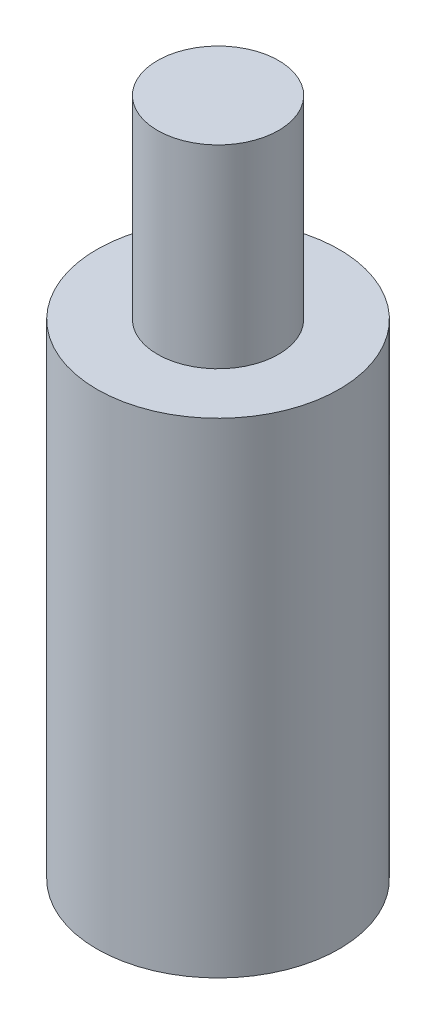
ISO-10303-21;
HEADER;
FILE_DESCRIPTION(('STEP AP214'),'2;1');
FILE_NAME('part.step','',(''),(''),'','','');
FILE_SCHEMA(('AUTOMOTIVE_DESIGN { 1 0 10303 214 1 1 1 1 }'));
ENDSEC;
DATA;
#1=APPLICATION_CONTEXT('core data for automotive mechanical design processes');
#2=APPLICATION_PROTOCOL_DEFINITION('international standard','automotive_design',2000,#1);
#3=PRODUCT_CONTEXT('',#1,'mechanical');
#4=PRODUCT('Part','Part','',(#3));
#5=PRODUCT_RELATED_PRODUCT_CATEGORY('part','',(#4));
#6=PRODUCT_DEFINITION_FORMATION('','',#4);
#7=PRODUCT_DEFINITION_CONTEXT('part definition',#1,'design');
#8=PRODUCT_DEFINITION('design','',#6,#7);
#9=PRODUCT_DEFINITION_SHAPE('','',#8);
#10=(LENGTH_UNIT() NAMED_UNIT(*) SI_UNIT(.MILLI.,.METRE.));
#11=(NAMED_UNIT(*) PLANE_ANGLE_UNIT() SI_UNIT($,.RADIAN.));
#12=(NAMED_UNIT(*) SI_UNIT($,.STERADIAN.) SOLID_ANGLE_UNIT());
#13=UNCERTAINTY_MEASURE_WITH_UNIT(LENGTH_MEASURE(1.E-05),#10,'distance_accuracy_value','');
#14=(GEOMETRIC_REPRESENTATION_CONTEXT(3) GLOBAL_UNCERTAINTY_ASSIGNED_CONTEXT((#13)) GLOBAL_UNIT_ASSIGNED_CONTEXT((#10,
#11,#12)) REPRESENTATION_CONTEXT('',''));
#15=CARTESIAN_POINT('',(0.,0.,0.));
#16=DIRECTION('',(0.,0.,1.));
#17=DIRECTION('',(1.,0.,0.));
#18=AXIS2_PLACEMENT_3D('',#15,#16,#17);
#19=CARTESIAN_POINT('',(0.,12.7,0.));
#20=DIRECTION('',(0.,-1.,0.));
#21=DIRECTION('',(0.,0.,-1.));
#22=AXIS2_PLACEMENT_3D('',#19,#20,#21);
#23=CYLINDRICAL_SURFACE('',#22,3.175);
#24=CARTESIAN_POINT('',(0.,12.7,0.));
#25=DIRECTION('',(0.,1.,0.));
#26=DIRECTION('',(0.,0.,1.));
#27=AXIS2_PLACEMENT_3D('',#24,#25,#26);
#28=CIRCLE('',#27,3.175);
#29=CARTESIAN_POINT('',(0.,12.7,3.175));
#30=VERTEX_POINT('',#29);
#31=EDGE_CURVE('E45',#30,#30,#28,.T.);
#32=ORIENTED_EDGE('',*,*,#31,.F.);
#33=EDGE_LOOP('',(#32));
#34=FACE_BOUND('',#33,.T.);
#35=CARTESIAN_POINT('',(0.,0.,0.));
#36=DIRECTION('',(0.,1.,0.));
#37=DIRECTION('',(0.,0.,1.));
#38=AXIS2_PLACEMENT_3D('',#35,#36,#37);
#39=CIRCLE('',#38,3.175);
#40=CARTESIAN_POINT('',(0.,0.,3.175));
#41=VERTEX_POINT('',#40);
#42=EDGE_CURVE('E40',#41,#41,#39,.T.);
#43=ORIENTED_EDGE('',*,*,#42,.T.);
#44=EDGE_LOOP('',(#43));
#45=FACE_BOUND('',#44,.T.);
#46=ADVANCED_FACE('F37',(#34,#45),#23,.T.);
#47=CARTESIAN_POINT('',(0.,12.7,0.));
#48=DIRECTION('',(0.,1.,0.));
#49=DIRECTION('',(0.,0.,1.));
#50=AXIS2_PLACEMENT_3D('',#47,#48,#49);
#51=PLANE('',#50);
#52=CARTESIAN_POINT('',(0.,12.7,0.));
#53=DIRECTION('',(0.,1.,0.));
#54=DIRECTION('',(0.,0.,1.));
#55=AXIS2_PLACEMENT_3D('',#52,#53,#54);
#56=CIRCLE('',#55,1.5875);
#57=CARTESIAN_POINT('',(0.,12.7,1.5875));
#58=VERTEX_POINT('',#57);
#59=EDGE_CURVE('E10',#58,#58,#56,.T.);
#60=ORIENTED_EDGE('',*,*,#59,.F.);
#61=EDGE_LOOP('',(#60));
#62=FACE_BOUND('',#61,.T.);
#63=ORIENTED_EDGE('',*,*,#31,.T.);
#64=EDGE_LOOP('',(#63));
#65=FACE_BOUND('',#64,.T.);
#66=ADVANCED_FACE('F65',(#62,#65),#51,.T.);
#67=CARTESIAN_POINT('',(0.,0.,0.));
#68=DIRECTION('',(0.,1.,0.));
#69=DIRECTION('',(0.,0.,1.));
#70=AXIS2_PLACEMENT_3D('',#67,#68,#69);
#71=PLANE('',#70);
#72=ORIENTED_EDGE('',*,*,#42,.F.);
#73=EDGE_LOOP('',(#72));
#74=FACE_BOUND('',#73,.T.);
#75=ADVANCED_FACE('F62',(#74),#71,.F.);
#76=CARTESIAN_POINT('',(0.,17.78,0.));
#77=DIRECTION('',(0.,-1.,0.));
#78=DIRECTION('',(0.,0.,-1.));
#79=AXIS2_PLACEMENT_3D('',#76,#77,#78);
#80=CYLINDRICAL_SURFACE('',#79,1.5875);
#81=CARTESIAN_POINT('',(0.,17.78,0.));
#82=DIRECTION('',(0.,1.,0.));
#83=DIRECTION('',(0.,0.,1.));
#84=AXIS2_PLACEMENT_3D('',#81,#82,#83);
#85=CIRCLE('',#84,1.5875);
#86=CARTESIAN_POINT('',(0.,17.78,1.5875));
#87=VERTEX_POINT('',#86);
#88=EDGE_CURVE('E52',#87,#87,#85,.T.);
#89=ORIENTED_EDGE('',*,*,#88,.F.);
#90=EDGE_LOOP('',(#89));
#91=FACE_BOUND('',#90,.T.);
#92=ORIENTED_EDGE('',*,*,#59,.T.);
#93=EDGE_LOOP('',(#92));
#94=FACE_BOUND('',#93,.T.);
#95=ADVANCED_FACE('F64',(#91,#94),#80,.T.);
#96=CARTESIAN_POINT('',(0.,17.78,0.));
#97=DIRECTION('',(0.,1.,0.));
#98=DIRECTION('',(0.,0.,1.));
#99=AXIS2_PLACEMENT_3D('',#96,#97,#98);
#100=PLANE('',#99);
#101=ORIENTED_EDGE('',*,*,#88,.T.);
#102=EDGE_LOOP('',(#101));
#103=FACE_BOUND('',#102,.T.);
#104=ADVANCED_FACE('F70',(#103),#100,.T.);
#105=CLOSED_SHELL('',(#46,#66,#75,#95,#104));
#106=MANIFOLD_SOLID_BREP('B2',#105);
#107=ADVANCED_BREP_SHAPE_REPRESENTATION('',(#18,#106),#14);
#108=SHAPE_DEFINITION_REPRESENTATION(#9,#107);
ENDSEC;
END-ISO-10303-21;
